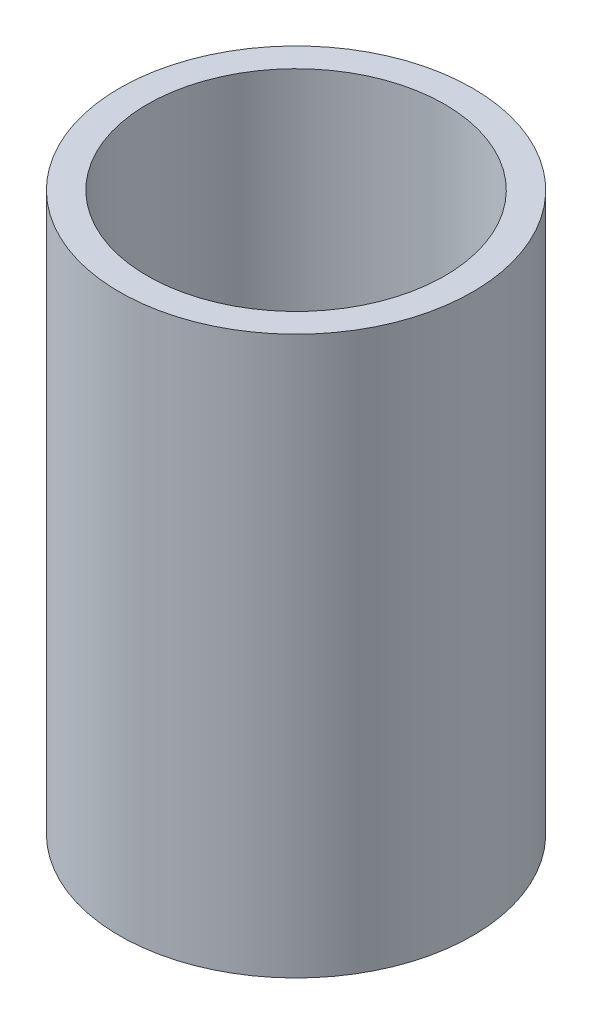
ISO-10303-21;
HEADER;
FILE_DESCRIPTION(('STEP AP214'),'2;1');
FILE_NAME('part.step','',(''),(''),'','','');
FILE_SCHEMA(('AUTOMOTIVE_DESIGN { 1 0 10303 214 1 1 1 1 }'));
ENDSEC;
DATA;
#1=APPLICATION_CONTEXT('core data for automotive mechanical design processes');
#2=APPLICATION_PROTOCOL_DEFINITION('international standard','automotive_design',2000,#1);
#3=PRODUCT_CONTEXT('',#1,'mechanical');
#4=PRODUCT('Part','Part','',(#3));
#5=PRODUCT_RELATED_PRODUCT_CATEGORY('part','',(#4));
#6=PRODUCT_DEFINITION_FORMATION('','',#4);
#7=PRODUCT_DEFINITION_CONTEXT('part definition',#1,'design');
#8=PRODUCT_DEFINITION('design','',#6,#7);
#9=PRODUCT_DEFINITION_SHAPE('','',#8);
#10=(LENGTH_UNIT() NAMED_UNIT(*) SI_UNIT(.MILLI.,.METRE.));
#11=(NAMED_UNIT(*) PLANE_ANGLE_UNIT() SI_UNIT($,.RADIAN.));
#12=(NAMED_UNIT(*) SI_UNIT($,.STERADIAN.) SOLID_ANGLE_UNIT());
#13=UNCERTAINTY_MEASURE_WITH_UNIT(LENGTH_MEASURE(1.E-05),#10,'distance_accuracy_value','');
#14=(GEOMETRIC_REPRESENTATION_CONTEXT(3) GLOBAL_UNCERTAINTY_ASSIGNED_CONTEXT((#13)) GLOBAL_UNIT_ASSIGNED_CONTEXT((#10,
#11,#12)) REPRESENTATION_CONTEXT('',''));
#15=CARTESIAN_POINT('',(0.,0.,0.));
#16=DIRECTION('',(0.,0.,1.));
#17=DIRECTION('',(1.,0.,0.));
#18=AXIS2_PLACEMENT_3D('',#15,#16,#17);
#19=CARTESIAN_POINT('',(0.,76.2,0.));
#20=DIRECTION('',(0.,-1.,0.));
#21=DIRECTION('',(0.,0.,-1.));
#22=AXIS2_PLACEMENT_3D('',#19,#20,#21);
#23=CYLINDRICAL_SURFACE('',#22,24.13);
#24=CARTESIAN_POINT('',(0.,76.2,0.));
#25=DIRECTION('',(0.,1.,0.));
#26=DIRECTION('',(0.,0.,1.));
#27=AXIS2_PLACEMENT_3D('',#24,#25,#26);
#28=CIRCLE('',#27,24.13);
#29=CARTESIAN_POINT('',(0.,76.2,-24.13));
#30=VERTEX_POINT('',#29);
#31=EDGE_CURVE('E10',#30,#30,#28,.T.);
#32=CARTESIAN_POINT('',(0.,0.,0.));
#33=DIRECTION('',(0.,1.,0.));
#34=DIRECTION('',(0.,0.,1.));
#35=AXIS2_PLACEMENT_3D('',#32,#33,#34);
#36=CIRCLE('',#35,24.13);
#37=CARTESIAN_POINT('',(0.,0.,-24.13));
#38=VERTEX_POINT('',#37);
#39=EDGE_CURVE('E34',#38,#38,#36,.T.);
#40=CARTESIAN_POINT('',(0.,76.2,-24.13));
#41=CARTESIAN_POINT('',(0.,75.40625,-24.13));
#42=CARTESIAN_POINT('',(0.,74.6125,-24.13));
#43=CARTESIAN_POINT('',(0.,73.025,-24.13));
#44=CARTESIAN_POINT('',(0.,72.23125,-24.13));
#45=CARTESIAN_POINT('',(0.,70.64375,-24.13));
#46=CARTESIAN_POINT('',(0.,69.85,-24.13));
#47=CARTESIAN_POINT('',(0.,68.2625,-24.13));
#48=CARTESIAN_POINT('',(0.,67.46875,-24.13));
#49=CARTESIAN_POINT('',(0.,65.88125,-24.13));
#50=CARTESIAN_POINT('',(0.,65.0875,-24.13));
#51=CARTESIAN_POINT('',(0.,63.5,-24.13));
#52=CARTESIAN_POINT('',(0.,62.70625,-24.13));
#53=CARTESIAN_POINT('',(0.,61.11875,-24.13));
#54=CARTESIAN_POINT('',(0.,60.325,-24.13));
#55=CARTESIAN_POINT('',(0.,58.7375,-24.13));
#56=CARTESIAN_POINT('',(0.,57.94375,-24.13));
#57=CARTESIAN_POINT('',(0.,56.35625,-24.13));
#58=CARTESIAN_POINT('',(0.,55.5625,-24.13));
#59=CARTESIAN_POINT('',(0.,53.975,-24.13));
#60=CARTESIAN_POINT('',(0.,53.18125,-24.13));
#61=CARTESIAN_POINT('',(0.,51.59375,-24.13));
#62=CARTESIAN_POINT('',(0.,50.8,-24.13));
#63=CARTESIAN_POINT('',(0.,49.2125,-24.13));
#64=CARTESIAN_POINT('',(0.,48.41875,-24.13));
#65=CARTESIAN_POINT('',(0.,46.83125,-24.13));
#66=CARTESIAN_POINT('',(0.,46.0375,-24.13));
#67=CARTESIAN_POINT('',(0.,44.45,-24.13));
#68=CARTESIAN_POINT('',(0.,43.65625,-24.13));
#69=CARTESIAN_POINT('',(0.,42.06875,-24.13));
#70=CARTESIAN_POINT('',(0.,41.275,-24.13));
#71=CARTESIAN_POINT('',(0.,39.6875,-24.13));
#72=CARTESIAN_POINT('',(0.,38.89375,-24.13));
#73=CARTESIAN_POINT('',(0.,37.30625,-24.13));
#74=CARTESIAN_POINT('',(0.,36.5125,-24.13));
#75=CARTESIAN_POINT('',(0.,34.925,-24.13));
#76=CARTESIAN_POINT('',(0.,34.13125,-24.13));
#77=CARTESIAN_POINT('',(0.,32.54375,-24.13));
#78=CARTESIAN_POINT('',(0.,31.75,-24.13));
#79=CARTESIAN_POINT('',(0.,30.1625,-24.13));
#80=CARTESIAN_POINT('',(0.,29.36875,-24.13));
#81=CARTESIAN_POINT('',(0.,27.78125,-24.13));
#82=CARTESIAN_POINT('',(0.,26.9875,-24.13));
#83=CARTESIAN_POINT('',(0.,25.4,-24.13));
#84=CARTESIAN_POINT('',(0.,24.60625,-24.13));
#85=CARTESIAN_POINT('',(0.,23.01875,-24.13));
#86=CARTESIAN_POINT('',(0.,22.225,-24.13));
#87=CARTESIAN_POINT('',(0.,20.6375,-24.13));
#88=CARTESIAN_POINT('',(0.,19.84375,-24.13));
#89=CARTESIAN_POINT('',(0.,18.25625,-24.13));
#90=CARTESIAN_POINT('',(0.,17.4625,-24.13));
#91=CARTESIAN_POINT('',(0.,15.875,-24.13));
#92=CARTESIAN_POINT('',(0.,15.08125,-24.13));
#93=CARTESIAN_POINT('',(0.,13.49375,-24.13));
#94=CARTESIAN_POINT('',(0.,12.7,-24.13));
#95=CARTESIAN_POINT('',(0.,11.1125,-24.13));
#96=CARTESIAN_POINT('',(0.,10.31875,-24.13));
#97=CARTESIAN_POINT('',(0.,8.73125,-24.13));
#98=CARTESIAN_POINT('',(0.,7.93750000000001,-24.13));
#99=CARTESIAN_POINT('',(0.,6.35,-24.13));
#100=CARTESIAN_POINT('',(0.,5.55625,-24.13));
#101=CARTESIAN_POINT('',(0.,3.96875,-24.13));
#102=CARTESIAN_POINT('',(0.,3.175,-24.13));
#103=CARTESIAN_POINT('',(0.,1.5875,-24.13));
#104=CARTESIAN_POINT('',(0.,0.793750000000001,-24.13));
#105=CARTESIAN_POINT('',(0.,0.,-24.13));
#106=B_SPLINE_CURVE_WITH_KNOTS('',3,(#40,#41,#42,#43,#44,#45,#46,#47,#48,#49,#50,#51,#52,#53,
#54,#55,#56,#57,#58,#59,#60,#61,#62,#63,#64,#65,#66,#67,#68,#69,#70,#71,#72,#73,#74,#75,#76,#77,
#78,#79,#80,#81,#82,#83,#84,#85,#86,#87,#88,#89,#90,#91,#92,#93,#94,#95,#96,#97,#98,#99,#100,
#101,#102,#103,#104,#105),.UNSPECIFIED.,.F.,.F.,(4,2,2,2,2,2,2,2,2,2,2,2,2,2,2,2,2,2,2,2,2,2,2,
2,2,2,2,2,2,2,2,2,4),(0.,2.38125,4.7625,7.14375,9.52500000000001,11.90625,14.2875,16.66875,
19.05,21.43125,23.8125,26.19375,28.575,30.95625,33.3375,35.71875,38.1,40.48125,42.8625,45.24375,
47.625,50.00625,52.3875,54.76875,57.15,59.53125,61.9125,64.29375,66.675,69.05625,71.4375,
73.81875,76.2),.UNSPECIFIED.);
#107=EDGE_CURVE('BSEAM31',#30,#38,#106,.T.);
#108=ORIENTED_EDGE('',*,*,#31,.F.);
#109=ORIENTED_EDGE('',*,*,#39,.T.);
#110=ORIENTED_EDGE('',*,*,#107,.T.);
#111=ORIENTED_EDGE('',*,*,#107,.F.);
#112=EDGE_LOOP('',(#108,#110,#109,#111));
#113=FACE_BOUND('',#112,.T.);
#114=ADVANCED_FACE('F31',(#113),#23,.T.);
#115=CARTESIAN_POINT('',(0.,76.2,0.));
#116=DIRECTION('',(0.,1.,0.));
#117=DIRECTION('',(0.,0.,1.));
#118=AXIS2_PLACEMENT_3D('',#115,#116,#117);
#119=PLANE('',#118);
#120=CARTESIAN_POINT('',(0.,76.2,0.));
#121=DIRECTION('',(0.,-1.,0.));
#122=DIRECTION('',(0.,0.,-1.));
#123=AXIS2_PLACEMENT_3D('',#120,#121,#122);
#124=CIRCLE('',#123,20.32);
#125=CARTESIAN_POINT('',(0.,76.2,-20.32));
#126=VERTEX_POINT('',#125);
#127=EDGE_CURVE('E41',#126,#126,#124,.T.);
#128=ORIENTED_EDGE('',*,*,#127,.T.);
#129=EDGE_LOOP('',(#128));
#130=FACE_BOUND('',#129,.T.);
#131=ORIENTED_EDGE('',*,*,#31,.T.);
#132=EDGE_LOOP('',(#131));
#133=FACE_BOUND('',#132,.T.);
#134=ADVANCED_FACE('F49',(#130,#133),#119,.T.);
#135=CARTESIAN_POINT('',(0.,0.,0.));
#136=DIRECTION('',(0.,1.,0.));
#137=DIRECTION('',(0.,0.,1.));
#138=AXIS2_PLACEMENT_3D('',#135,#136,#137);
#139=PLANE('',#138);
#140=CARTESIAN_POINT('',(0.,0.,0.));
#141=DIRECTION('',(0.,-1.,0.));
#142=DIRECTION('',(0.,0.,-1.));
#143=AXIS2_PLACEMENT_3D('',#140,#141,#142);
#144=CIRCLE('',#143,20.32);
#145=CARTESIAN_POINT('',(0.,0.,-20.32));
#146=VERTEX_POINT('',#145);
#147=EDGE_CURVE('E43',#146,#146,#144,.T.);
#148=ORIENTED_EDGE('',*,*,#147,.F.);
#149=EDGE_LOOP('',(#148));
#150=FACE_BOUND('',#149,.T.);
#151=ORIENTED_EDGE('',*,*,#39,.F.);
#152=EDGE_LOOP('',(#151));
#153=FACE_BOUND('',#152,.T.);
#154=ADVANCED_FACE('F54',(#150,#153),#139,.F.);
#155=CARTESIAN_POINT('',(0.,76.2,0.));
#156=DIRECTION('',(0.,-1.,0.));
#157=DIRECTION('',(0.,0.,-1.));
#158=AXIS2_PLACEMENT_3D('',#155,#156,#157);
#159=CYLINDRICAL_SURFACE('',#158,20.32);
#160=CARTESIAN_POINT('',(0.,76.2,-20.32));
#161=CARTESIAN_POINT('',(0.,75.40625,-20.32));
#162=CARTESIAN_POINT('',(0.,74.6125,-20.32));
#163=CARTESIAN_POINT('',(0.,73.025,-20.32));
#164=CARTESIAN_POINT('',(0.,72.23125,-20.32));
#165=CARTESIAN_POINT('',(0.,70.64375,-20.32));
#166=CARTESIAN_POINT('',(0.,69.85,-20.32));
#167=CARTESIAN_POINT('',(0.,68.2625,-20.32));
#168=CARTESIAN_POINT('',(0.,67.46875,-20.32));
#169=CARTESIAN_POINT('',(0.,65.88125,-20.32));
#170=CARTESIAN_POINT('',(0.,65.0875,-20.32));
#171=CARTESIAN_POINT('',(0.,63.5,-20.32));
#172=CARTESIAN_POINT('',(0.,62.70625,-20.32));
#173=CARTESIAN_POINT('',(0.,61.11875,-20.32));
#174=CARTESIAN_POINT('',(0.,60.325,-20.32));
#175=CARTESIAN_POINT('',(0.,58.7375,-20.32));
#176=CARTESIAN_POINT('',(0.,57.94375,-20.32));
#177=CARTESIAN_POINT('',(0.,56.35625,-20.32));
#178=CARTESIAN_POINT('',(0.,55.5625,-20.32));
#179=CARTESIAN_POINT('',(0.,53.975,-20.32));
#180=CARTESIAN_POINT('',(0.,53.18125,-20.32));
#181=CARTESIAN_POINT('',(0.,51.59375,-20.32));
#182=CARTESIAN_POINT('',(0.,50.8,-20.32));
#183=CARTESIAN_POINT('',(0.,49.2125,-20.32));
#184=CARTESIAN_POINT('',(0.,48.41875,-20.32));
#185=CARTESIAN_POINT('',(0.,46.83125,-20.32));
#186=CARTESIAN_POINT('',(0.,46.0375,-20.32));
#187=CARTESIAN_POINT('',(0.,44.45,-20.32));
#188=CARTESIAN_POINT('',(0.,43.65625,-20.32));
#189=CARTESIAN_POINT('',(0.,42.06875,-20.32));
#190=CARTESIAN_POINT('',(0.,41.275,-20.32));
#191=CARTESIAN_POINT('',(0.,39.6875,-20.32));
#192=CARTESIAN_POINT('',(0.,38.89375,-20.32));
#193=CARTESIAN_POINT('',(0.,37.30625,-20.32));
#194=CARTESIAN_POINT('',(0.,36.5125,-20.32));
#195=CARTESIAN_POINT('',(0.,34.925,-20.32));
#196=CARTESIAN_POINT('',(0.,34.13125,-20.32));
#197=CARTESIAN_POINT('',(0.,32.54375,-20.32));
#198=CARTESIAN_POINT('',(0.,31.75,-20.32));
#199=CARTESIAN_POINT('',(0.,30.1625,-20.32));
#200=CARTESIAN_POINT('',(0.,29.36875,-20.32));
#201=CARTESIAN_POINT('',(0.,27.78125,-20.32));
#202=CARTESIAN_POINT('',(0.,26.9875,-20.32));
#203=CARTESIAN_POINT('',(0.,25.4,-20.32));
#204=CARTESIAN_POINT('',(0.,24.60625,-20.32));
#205=CARTESIAN_POINT('',(0.,23.01875,-20.32));
#206=CARTESIAN_POINT('',(0.,22.225,-20.32));
#207=CARTESIAN_POINT('',(0.,20.6375,-20.32));
#208=CARTESIAN_POINT('',(0.,19.84375,-20.32));
#209=CARTESIAN_POINT('',(0.,18.25625,-20.32));
#210=CARTESIAN_POINT('',(0.,17.4625,-20.32));
#211=CARTESIAN_POINT('',(0.,15.875,-20.32));
#212=CARTESIAN_POINT('',(0.,15.08125,-20.32));
#213=CARTESIAN_POINT('',(0.,13.49375,-20.32));
#214=CARTESIAN_POINT('',(0.,12.7,-20.32));
#215=CARTESIAN_POINT('',(0.,11.1125,-20.32));
#216=CARTESIAN_POINT('',(0.,10.31875,-20.32));
#217=CARTESIAN_POINT('',(0.,8.73125,-20.32));
#218=CARTESIAN_POINT('',(0.,7.93750000000001,-20.32));
#219=CARTESIAN_POINT('',(0.,6.35,-20.32));
#220=CARTESIAN_POINT('',(0.,5.55625,-20.32));
#221=CARTESIAN_POINT('',(0.,3.96875,-20.32));
#222=CARTESIAN_POINT('',(0.,3.175,-20.32));
#223=CARTESIAN_POINT('',(0.,1.5875,-20.32));
#224=CARTESIAN_POINT('',(0.,0.793750000000001,-20.32));
#225=CARTESIAN_POINT('',(0.,0.,-20.32));
#226=B_SPLINE_CURVE_WITH_KNOTS('',3,(#160,#161,#162,#163,#164,#165,#166,#167,#168,#169,#170,
#171,#172,#173,#174,#175,#176,#177,#178,#179,#180,#181,#182,#183,#184,#185,#186,#187,#188,#189,
#190,#191,#192,#193,#194,#195,#196,#197,#198,#199,#200,#201,#202,#203,#204,#205,#206,#207,#208,
#209,#210,#211,#212,#213,#214,#215,#216,#217,#218,#219,#220,#221,#222,#223,#224,#225),
.UNSPECIFIED.,.F.,.F.,(4,2,2,2,2,2,2,2,2,2,2,2,2,2,2,2,2,2,2,2,2,2,2,2,2,2,2,2,2,2,2,2,4),(0.,
2.38125,4.7625,7.14375,9.52500000000001,11.90625,14.2875,16.66875,19.05,21.43125,23.8125,
26.19375,28.575,30.95625,33.3375,35.71875,38.1,40.48125,42.8625,45.24375,47.625,50.00625,
52.3875,54.76875,57.15,59.53125,61.9125,64.29375,66.675,69.05625,71.4375,73.81875,76.2),.UNSPECIFIED.);
#227=EDGE_CURVE('BSEAM51',#126,#146,#226,.T.);
#228=ORIENTED_EDGE('',*,*,#127,.F.);
#229=ORIENTED_EDGE('',*,*,#147,.T.);
#230=ORIENTED_EDGE('',*,*,#227,.T.);
#231=ORIENTED_EDGE('',*,*,#227,.F.);
#232=EDGE_LOOP('',(#228,#230,#229,#231));
#233=FACE_BOUND('',#232,.T.);
#234=ADVANCED_FACE('F51',(#233),#159,.F.);
#235=CLOSED_SHELL('',(#114,#134,#154,#234));
#236=MANIFOLD_SOLID_BREP('B2',#235);
#237=ADVANCED_BREP_SHAPE_REPRESENTATION('',(#18,#236),#14);
#238=SHAPE_DEFINITION_REPRESENTATION(#9,#237);
ENDSEC;
END-ISO-10303-21;
